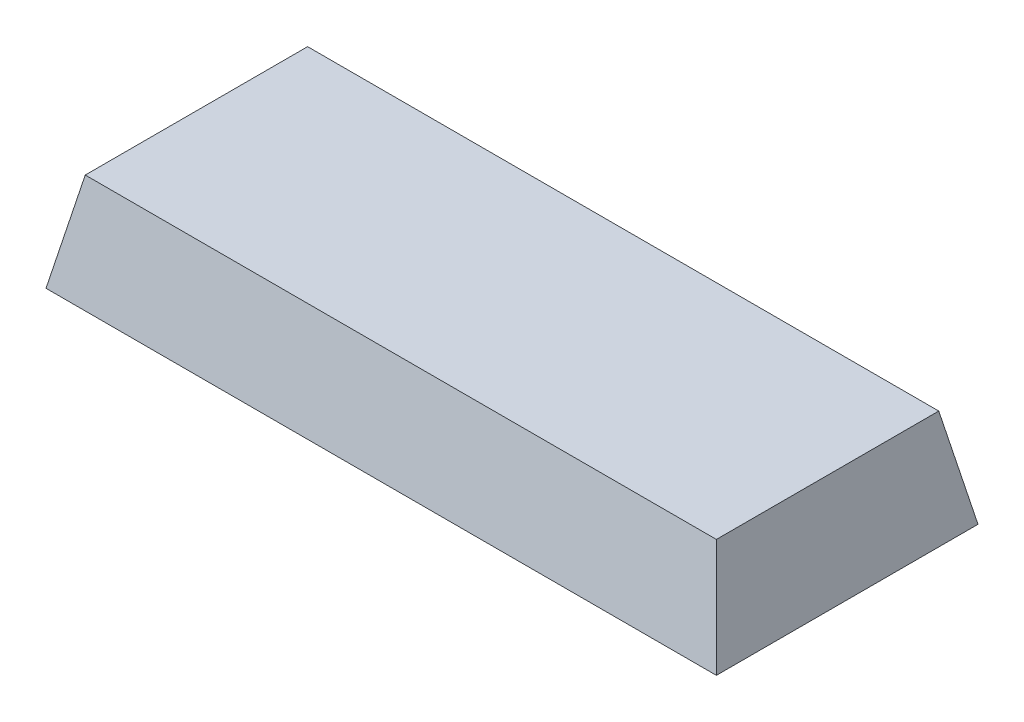
ISO-10303-21;
HEADER;
FILE_DESCRIPTION(('STEP AP214'),'2;1');
FILE_NAME('part.step','',(''),(''),'','','');
FILE_SCHEMA(('AUTOMOTIVE_DESIGN { 1 0 10303 214 1 1 1 1 }'));
ENDSEC;
DATA;
#1=APPLICATION_CONTEXT('core data for automotive mechanical design processes');
#2=APPLICATION_PROTOCOL_DEFINITION('international standard','automotive_design',2000,#1);
#3=PRODUCT_CONTEXT('',#1,'mechanical');
#4=PRODUCT('Part','Part','',(#3));
#5=PRODUCT_RELATED_PRODUCT_CATEGORY('part','',(#4));
#6=PRODUCT_DEFINITION_FORMATION('','',#4);
#7=PRODUCT_DEFINITION_CONTEXT('part definition',#1,'design');
#8=PRODUCT_DEFINITION('design','',#6,#7);
#9=PRODUCT_DEFINITION_SHAPE('','',#8);
#10=(LENGTH_UNIT() NAMED_UNIT(*) SI_UNIT(.MILLI.,.METRE.));
#11=(NAMED_UNIT(*) PLANE_ANGLE_UNIT() SI_UNIT($,.RADIAN.));
#12=(NAMED_UNIT(*) SI_UNIT($,.STERADIAN.) SOLID_ANGLE_UNIT());
#13=UNCERTAINTY_MEASURE_WITH_UNIT(LENGTH_MEASURE(1.E-05),#10,'distance_accuracy_value','');
#14=(GEOMETRIC_REPRESENTATION_CONTEXT(3) GLOBAL_UNCERTAINTY_ASSIGNED_CONTEXT((#13)) GLOBAL_UNIT_ASSIGNED_CONTEXT((#10,
#11,#12)) REPRESENTATION_CONTEXT('',''));
#15=CARTESIAN_POINT('',(0.,0.,0.));
#16=DIRECTION('',(0.,0.,1.));
#17=DIRECTION('',(1.,0.,0.));
#18=AXIS2_PLACEMENT_3D('',#15,#16,#17);
#19=CARTESIAN_POINT('',(0.,3.,0.));
#20=DIRECTION('',(0.,-1.,0.));
#21=DIRECTION('',(0.,0.,-1.));
#22=AXIS2_PLACEMENT_3D('',#19,#20,#21);
#23=PLANE('',#22);
#24=DIRECTION('',(-1.,0.,0.));
#25=VECTOR('',#24,1.);
#26=CARTESIAN_POINT('',(20.500055,3.,-0.6));
#27=LINE('',#26,#25);
#28=CARTESIAN_POINT('',(19.9,3.,-0.6));
#29=VERTEX_POINT('',#28);
#30=CARTESIAN_POINT('',(0.6,3.,-0.6));
#31=VERTEX_POINT('',#30);
#32=EDGE_CURVE('E145',#29,#31,#27,.T.);
#33=ORIENTED_EDGE('',*,*,#32,.F.);
#34=DIRECTION('',(0.,0.,1.));
#35=VECTOR('',#34,1.);
#36=CARTESIAN_POINT('',(19.9,3.,-8.));
#37=LINE('',#36,#35);
#38=CARTESIAN_POINT('',(19.9,3.,-7.4));
#39=VERTEX_POINT('',#38);
#40=EDGE_CURVE('E155',#39,#29,#37,.T.);
#41=ORIENTED_EDGE('',*,*,#40,.F.);
#42=DIRECTION('',(-1.,0.,0.));
#43=VECTOR('',#42,1.);
#44=CARTESIAN_POINT('',(20.500055,3.,-7.4));
#45=LINE('',#44,#43);
#46=CARTESIAN_POINT('',(0.599999999999998,3.,-7.4));
#47=VERTEX_POINT('',#46);
#48=EDGE_CURVE('E140',#39,#47,#45,.T.);
#49=ORIENTED_EDGE('',*,*,#48,.T.);
#50=DIRECTION('',(0.,0.,1.));
#51=VECTOR('',#50,1.);
#52=CARTESIAN_POINT('',(0.6,3.,-8.));
#53=LINE('',#52,#51);
#54=EDGE_CURVE('E161',#47,#31,#53,.T.);
#55=ORIENTED_EDGE('',*,*,#54,.T.);
#56=EDGE_LOOP('',(#33,#41,#49,#55));
#57=FACE_BOUND('',#56,.T.);
#58=ADVANCED_FACE('F43',(#57),#23,.F.);
#59=CARTESIAN_POINT('',(20.5,0.,-8.));
#60=DIRECTION('',(-0.98058067569092,-0.196116135138184,0.));
#61=DIRECTION('',(0.196116135138184,-0.98058067569092,0.));
#62=AXIS2_PLACEMENT_3D('',#59,#60,#61);
#63=PLANE('',#62);
#64=DIRECTION('',(-0.192450089729875,0.962250448649376,-0.192450089729875));
#65=VECTOR('',#64,1.);
#66=CARTESIAN_POINT('',(20.2037037037037,1.48148148148148,-0.296296296296295));
#67=LINE('',#66,#65);
#68=CARTESIAN_POINT('',(20.5000245,0.,0.));
#69=VERTEX_POINT('',#68);
#70=EDGE_CURVE('E152',#69,#29,#67,.T.);
#71=ORIENTED_EDGE('',*,*,#70,.F.);
#72=DIRECTION('',(0.,0.,-1.));
#73=VECTOR('',#72,1.);
#74=CARTESIAN_POINT('',(20.5,0.,0.));
#75=LINE('',#74,#73);
#76=CARTESIAN_POINT('',(20.5000025,0.,-8.));
#77=VERTEX_POINT('',#76);
#78=EDGE_CURVE('E180',#69,#77,#75,.T.);
#79=ORIENTED_EDGE('',*,*,#78,.T.);
#80=DIRECTION('',(0.192450089729875,-0.962250448649376,-0.192450089729875));
#81=VECTOR('',#80,1.);
#82=CARTESIAN_POINT('',(20.5,0.,-8.));
#83=LINE('',#82,#81);
#84=EDGE_CURVE('E148',#39,#77,#83,.T.);
#85=ORIENTED_EDGE('',*,*,#84,.F.);
#86=ORIENTED_EDGE('',*,*,#40,.T.);
#87=EDGE_LOOP('',(#71,#79,#85,#86));
#88=FACE_BOUND('',#87,.T.);
#89=ADVANCED_FACE('F220',(#88),#63,.F.);
#90=CARTESIAN_POINT('',(0.,0.,-8.));
#91=DIRECTION('',(0.98058067569092,-0.196116135138184,0.));
#92=DIRECTION('',(0.196116135138184,0.98058067569092,0.));
#93=AXIS2_PLACEMENT_3D('',#90,#91,#92);
#94=PLANE('',#93);
#95=DIRECTION('',(-0.192450089729875,-0.962250448649376,0.192450089729875));
#96=VECTOR('',#95,1.);
#97=CARTESIAN_POINT('',(0.296296296296296,1.48148148148148,-0.296296296296295));
#98=LINE('',#97,#96);
#99=CARTESIAN_POINT('',(-2.5E-06,0.,0.));
#100=VERTEX_POINT('',#99);
#101=EDGE_CURVE('E186',#31,#100,#98,.T.);
#102=ORIENTED_EDGE('',*,*,#101,.F.);
#103=ORIENTED_EDGE('',*,*,#54,.F.);
#104=DIRECTION('',(0.192450089729875,0.962250448649376,0.192450089729875));
#105=VECTOR('',#104,1.);
#106=CARTESIAN_POINT('',(0.,0.,-8.));
#107=LINE('',#106,#105);
#108=CARTESIAN_POINT('',(0.,0.,-8.));
#109=VERTEX_POINT('',#108);
#110=EDGE_CURVE('E171',#109,#47,#107,.T.);
#111=ORIENTED_EDGE('',*,*,#110,.F.);
#112=DIRECTION('',(0.,0.,1.));
#113=VECTOR('',#112,1.);
#114=CARTESIAN_POINT('',(0.,0.,0.));
#115=LINE('',#114,#113);
#116=EDGE_CURVE('E201',#109,#100,#115,.T.);
#117=ORIENTED_EDGE('',*,*,#116,.T.);
#118=EDGE_LOOP('',(#102,#103,#111,#117));
#119=FACE_BOUND('',#118,.T.);
#120=ADVANCED_FACE('F226',(#119),#94,.F.);
#121=CARTESIAN_POINT('',(0.,0.,0.));
#122=DIRECTION('',(0.,-1.,0.));
#123=DIRECTION('',(0.,0.,-1.));
#124=AXIS2_PLACEMENT_3D('',#121,#122,#123);
#125=PLANE('',#124);
#126=DIRECTION('',(0.,0.,-1.));
#127=VECTOR('',#126,1.);
#128=CARTESIAN_POINT('',(6.250011,0.,-8.));
#129=LINE('',#128,#127);
#130=CARTESIAN_POINT('',(6.250011,0.,-6.9));
#131=VERTEX_POINT('',#130);
#132=CARTESIAN_POINT('',(6.250011,0.,-8.));
#133=VERTEX_POINT('',#132);
#134=EDGE_CURVE('E122',#131,#133,#129,.T.);
#135=ORIENTED_EDGE('',*,*,#134,.F.);
#136=DIRECTION('',(-1.,0.,0.));
#137=VECTOR('',#136,1.);
#138=CARTESIAN_POINT('',(6.250011,0.,-6.9));
#139=LINE('',#138,#137);
#140=CARTESIAN_POINT('',(14.250011,0.,-6.9));
#141=VERTEX_POINT('',#140);
#142=EDGE_CURVE('E110',#141,#131,#139,.T.);
#143=ORIENTED_EDGE('',*,*,#142,.F.);
#144=DIRECTION('',(0.,0.,1.));
#145=VECTOR('',#144,1.);
#146=CARTESIAN_POINT('',(14.250011,0.,-8.));
#147=LINE('',#146,#145);
#148=CARTESIAN_POINT('',(14.250011,0.,-8.));
#149=VERTEX_POINT('',#148);
#150=EDGE_CURVE('E118',#149,#141,#147,.T.);
#151=ORIENTED_EDGE('',*,*,#150,.F.);
#152=DIRECTION('',(-1.,0.,0.));
#153=VECTOR('',#152,1.);
#154=CARTESIAN_POINT('',(0.,0.,-8.));
#155=LINE('',#154,#153);
#156=EDGE_CURVE('E168',#77,#149,#155,.T.);
#157=ORIENTED_EDGE('',*,*,#156,.F.);
#158=ORIENTED_EDGE('',*,*,#78,.F.);
#159=DIRECTION('',(1.,0.,0.));
#160=VECTOR('',#159,1.);
#161=CARTESIAN_POINT('',(0.,0.,0.));
#162=LINE('',#161,#160);
#163=EDGE_CURVE('E357',#100,#69,#162,.T.);
#164=ORIENTED_EDGE('',*,*,#163,.F.);
#165=ORIENTED_EDGE('',*,*,#116,.F.);
#166=EDGE_CURVE('E172',#133,#109,#155,.T.);
#167=ORIENTED_EDGE('',*,*,#166,.F.);
#168=EDGE_LOOP('',(#135,#143,#151,#157,#158,#164,#165,#167));
#169=FACE_BOUND('',#168,.T.);
#170=CARTESIAN_POINT('',(10.25000125,0.,-3.75));
#171=DIRECTION('',(0.,-1.,0.));
#172=DIRECTION('',(0.,0.,-1.));
#173=AXIS2_PLACEMENT_3D('',#170,#171,#172);
#174=CIRCLE('',#173,1.8);
#175=CARTESIAN_POINT('',(10.25000125,0.,-5.55));
#176=VERTEX_POINT('',#175);
#177=EDGE_CURVE('E141',#176,#176,#174,.T.);
#178=ORIENTED_EDGE('',*,*,#177,.F.);
#179=EDGE_LOOP('',(#178));
#180=FACE_BOUND('',#179,.T.);
#181=ADVANCED_FACE('F115',(#169,#180),#125,.T.);
#182=CARTESIAN_POINT('',(20.500055,3.,-7.4));
#183=DIRECTION('',(0.,0.196116135138184,-0.98058067569092));
#184=DIRECTION('',(0.,0.98058067569092,0.196116135138184));
#185=AXIS2_PLACEMENT_3D('',#182,#183,#184);
#186=PLANE('',#185);
#187=ORIENTED_EDGE('',*,*,#84,.T.);
#188=ORIENTED_EDGE('',*,*,#156,.T.);
#189=DIRECTION('',(1.,0.,0.));
#190=VECTOR('',#189,1.);
#191=CARTESIAN_POINT('',(6.250011,0.,-8.));
#192=LINE('',#191,#190);
#193=EDGE_CURVE('E129',#133,#149,#192,.T.);
#194=ORIENTED_EDGE('',*,*,#193,.F.);
#195=ORIENTED_EDGE('',*,*,#166,.T.);
#196=ORIENTED_EDGE('',*,*,#110,.T.);
#197=ORIENTED_EDGE('',*,*,#48,.F.);
#198=EDGE_LOOP('',(#187,#188,#194,#195,#196,#197));
#199=FACE_BOUND('',#198,.T.);
#200=ADVANCED_FACE('F204',(#199),#186,.T.);
#201=CARTESIAN_POINT('',(20.500055,0.,0.));
#202=DIRECTION('',(0.,0.196116135138184,0.98058067569092));
#203=DIRECTION('',(0.,-0.98058067569092,0.196116135138184));
#204=AXIS2_PLACEMENT_3D('',#201,#202,#203);
#205=PLANE('',#204);
#206=ORIENTED_EDGE('',*,*,#70,.T.);
#207=ORIENTED_EDGE('',*,*,#32,.T.);
#208=ORIENTED_EDGE('',*,*,#101,.T.);
#209=ORIENTED_EDGE('',*,*,#163,.T.);
#210=EDGE_LOOP('',(#206,#207,#208,#209));
#211=FACE_BOUND('',#210,.T.);
#212=ADVANCED_FACE('F237',(#211),#205,.T.);
#213=CARTESIAN_POINT('',(10.25000125,0.8,-3.75));
#214=DIRECTION('',(0.,-1.,0.));
#215=DIRECTION('',(0.,0.,-1.));
#216=AXIS2_PLACEMENT_3D('',#213,#214,#215);
#217=CYLINDRICAL_SURFACE('',#216,1.8);
#218=CARTESIAN_POINT('',(10.25000125,0.8,-3.75));
#219=DIRECTION('',(0.,-1.,0.));
#220=DIRECTION('',(0.,0.,-1.));
#221=AXIS2_PLACEMENT_3D('',#218,#219,#220);
#222=CIRCLE('',#221,1.8);
#223=CARTESIAN_POINT('',(10.25000125,0.8,-5.55));
#224=VERTEX_POINT('',#223);
#225=EDGE_CURVE('E136',#224,#224,#222,.T.);
#226=ORIENTED_EDGE('',*,*,#225,.F.);
#227=EDGE_LOOP('',(#226));
#228=FACE_BOUND('',#227,.T.);
#229=ORIENTED_EDGE('',*,*,#177,.T.);
#230=EDGE_LOOP('',(#229));
#231=FACE_BOUND('',#230,.T.);
#232=ADVANCED_FACE('F246',(#228,#231),#217,.F.);
#233=CARTESIAN_POINT('',(10.25000125,0.8,-3.75));
#234=DIRECTION('',(0.,-1.,0.));
#235=DIRECTION('',(0.,0.,-1.));
#236=AXIS2_PLACEMENT_3D('',#233,#234,#235);
#237=PLANE('',#236);
#238=ORIENTED_EDGE('',*,*,#225,.T.);
#239=EDGE_LOOP('',(#238));
#240=FACE_BOUND('',#239,.T.);
#241=ADVANCED_FACE('F250',(#240),#237,.T.);
#242=CARTESIAN_POINT('',(6.250011,-2.,-8.));
#243=DIRECTION('',(0.,0.,1.));
#244=DIRECTION('',(1.,0.,0.));
#245=AXIS2_PLACEMENT_3D('',#242,#243,#244);
#246=PLANE('',#245);
#247=ORIENTED_EDGE('',*,*,#193,.T.);
#248=CARTESIAN_POINT('',(10.7859093848622,2.,-8.));
#249=DIRECTION('',(0.,0.,1.));
#250=DIRECTION('',(1.,0.,0.));
#251=AXIS2_PLACEMENT_3D('',#248,#249,#250);
#252=CIRCLE('',#251,4.);
#253=CARTESIAN_POINT('',(10.7859093848622,-2.,-8.));
#254=VERTEX_POINT('',#253);
#255=EDGE_CURVE('E11',#149,#254,#252,.F.);
#256=ORIENTED_EDGE('',*,*,#255,.T.);
#257=DIRECTION('',(1.,0.,0.));
#258=VECTOR('',#257,1.);
#259=CARTESIAN_POINT('',(6.250011,-2.,-8.));
#260=LINE('',#259,#258);
#261=CARTESIAN_POINT('',(9.71411261513775,-2.,-8.));
#262=VERTEX_POINT('',#261);
#263=EDGE_CURVE('E124',#262,#254,#260,.T.);
#264=ORIENTED_EDGE('',*,*,#263,.F.);
#265=CARTESIAN_POINT('',(9.71411261513775,2.,-8.));
#266=DIRECTION('',(0.,0.,1.));
#267=DIRECTION('',(1.,0.,0.));
#268=AXIS2_PLACEMENT_3D('',#265,#266,#267);
#269=CIRCLE('',#268,4.);
#270=EDGE_CURVE('E52',#262,#133,#269,.F.);
#271=ORIENTED_EDGE('',*,*,#270,.T.);
#272=EDGE_LOOP('',(#247,#256,#264,#271));
#273=FACE_BOUND('',#272,.T.);
#274=ADVANCED_FACE('F193',(#273),#246,.F.);
#275=CARTESIAN_POINT('',(6.250011,-2.,-6.9));
#276=DIRECTION('',(0.,0.,-1.));
#277=DIRECTION('',(-1.,0.,0.));
#278=AXIS2_PLACEMENT_3D('',#275,#276,#277);
#279=PLANE('',#278);
#280=DIRECTION('',(-1.,0.,0.));
#281=VECTOR('',#280,1.);
#282=CARTESIAN_POINT('',(6.250011,-2.,-6.9));
#283=LINE('',#282,#281);
#284=CARTESIAN_POINT('',(10.7859093848622,-2.,-6.9));
#285=VERTEX_POINT('',#284);
#286=CARTESIAN_POINT('',(9.71411261513775,-2.,-6.9));
#287=VERTEX_POINT('',#286);
#288=EDGE_CURVE('E111',#285,#287,#283,.T.);
#289=ORIENTED_EDGE('',*,*,#288,.F.);
#290=CARTESIAN_POINT('',(10.7859093848622,2.,-6.9));
#291=DIRECTION('',(0.,0.,-1.));
#292=DIRECTION('',(-1.,0.,0.));
#293=AXIS2_PLACEMENT_3D('',#290,#291,#292);
#294=CIRCLE('',#293,4.);
#295=EDGE_CURVE('E67',#285,#141,#294,.F.);
#296=ORIENTED_EDGE('',*,*,#295,.T.);
#297=ORIENTED_EDGE('',*,*,#142,.T.);
#298=CARTESIAN_POINT('',(9.71411261513775,2.,-6.9));
#299=DIRECTION('',(0.,0.,-1.));
#300=DIRECTION('',(-1.,0.,0.));
#301=AXIS2_PLACEMENT_3D('',#298,#299,#300);
#302=CIRCLE('',#301,4.);
#303=EDGE_CURVE('E59',#131,#287,#302,.F.);
#304=ORIENTED_EDGE('',*,*,#303,.T.);
#305=EDGE_LOOP('',(#289,#296,#297,#304));
#306=FACE_BOUND('',#305,.T.);
#307=ADVANCED_FACE('F109',(#306),#279,.F.);
#308=CARTESIAN_POINT('',(0.,-2.,0.));
#309=DIRECTION('',(0.,1.,0.));
#310=DIRECTION('',(0.,0.,1.));
#311=AXIS2_PLACEMENT_3D('',#308,#309,#310);
#312=PLANE('',#311);
#313=ORIENTED_EDGE('',*,*,#263,.T.);
#314=DIRECTION('',(0.,0.,1.));
#315=VECTOR('',#314,1.);
#316=CARTESIAN_POINT('',(10.7859093848622,-2.,0.));
#317=LINE('',#316,#315);
#318=EDGE_CURVE('E185',#254,#285,#317,.T.);
#319=ORIENTED_EDGE('',*,*,#318,.T.);
#320=ORIENTED_EDGE('',*,*,#288,.T.);
#321=DIRECTION('',(0.,0.,-1.));
#322=VECTOR('',#321,1.);
#323=CARTESIAN_POINT('',(9.71411261513775,-2.,0.));
#324=LINE('',#323,#322);
#325=EDGE_CURVE('E181',#287,#262,#324,.T.);
#326=ORIENTED_EDGE('',*,*,#325,.T.);
#327=EDGE_LOOP('',(#313,#319,#320,#326));
#328=FACE_BOUND('',#327,.T.);
#329=ADVANCED_FACE('F211',(#328),#312,.F.);
#330=CARTESIAN_POINT('',(10.7859093848622,2.,-8.00000000000001));
#331=DIRECTION('',(0.,0.,1.));
#332=DIRECTION('',(1.,0.,0.));
#333=AXIS2_PLACEMENT_3D('',#330,#331,#332);
#334=CYLINDRICAL_SURFACE('',#333,4.);
#335=ORIENTED_EDGE('',*,*,#255,.F.);
#336=ORIENTED_EDGE('',*,*,#150,.T.);
#337=ORIENTED_EDGE('',*,*,#295,.F.);
#338=ORIENTED_EDGE('',*,*,#318,.F.);
#339=EDGE_LOOP('',(#335,#336,#337,#338));
#340=FACE_BOUND('',#339,.T.);
#341=ADVANCED_FACE('F127',(#340),#334,.T.);
#342=CARTESIAN_POINT('',(9.71411261513775,2.,-8.));
#343=DIRECTION('',(0.,0.,-1.));
#344=DIRECTION('',(-1.,0.,0.));
#345=AXIS2_PLACEMENT_3D('',#342,#343,#344);
#346=CYLINDRICAL_SURFACE('',#345,4.);
#347=ORIENTED_EDGE('',*,*,#303,.F.);
#348=ORIENTED_EDGE('',*,*,#134,.T.);
#349=ORIENTED_EDGE('',*,*,#270,.F.);
#350=ORIENTED_EDGE('',*,*,#325,.F.);
#351=EDGE_LOOP('',(#347,#348,#349,#350));
#352=FACE_BOUND('',#351,.T.);
#353=ADVANCED_FACE('F45',(#352),#346,.T.);
#354=CLOSED_SHELL('',(#58,#89,#120,#181,#200,#212,#232,#241,#274,#307,#329,#341,#353));
#355=MANIFOLD_SOLID_BREP('B2',#354);
#356=ADVANCED_BREP_SHAPE_REPRESENTATION('',(#18,#355),#14);
#357=SHAPE_DEFINITION_REPRESENTATION(#9,#356);
ENDSEC;
END-ISO-10303-21;
